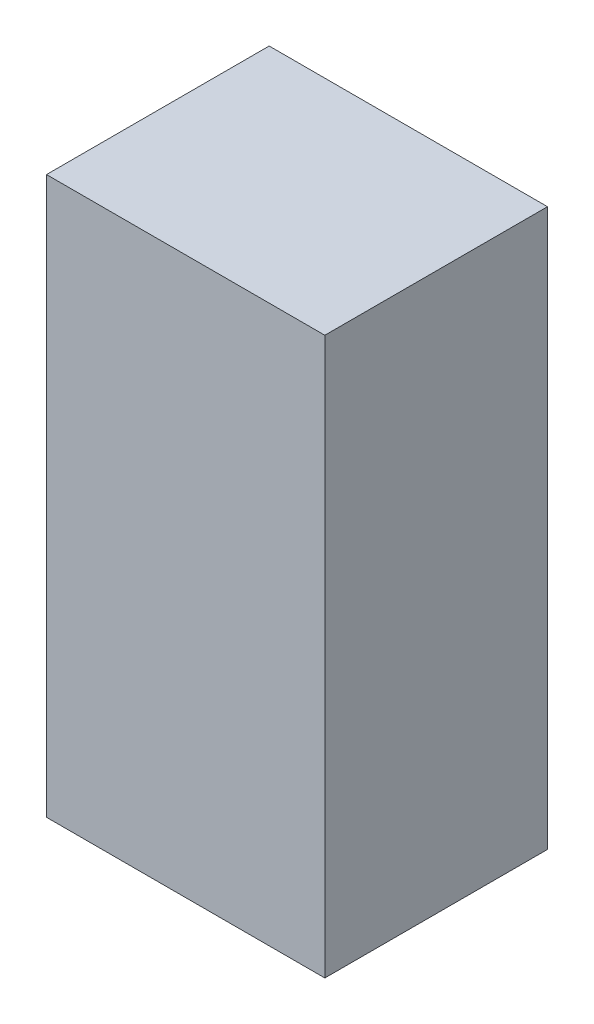
ISO-10303-21;
HEADER;
FILE_DESCRIPTION(('STEP AP214'),'2;1');
FILE_NAME('part.step','',(''),(''),'','','');
FILE_SCHEMA(('AUTOMOTIVE_DESIGN { 1 0 10303 214 1 1 1 1 }'));
ENDSEC;
DATA;
#1=APPLICATION_CONTEXT('core data for automotive mechanical design processes');
#2=APPLICATION_PROTOCOL_DEFINITION('international standard','automotive_design',2000,#1);
#3=PRODUCT_CONTEXT('',#1,'mechanical');
#4=PRODUCT('Part','Part','',(#3));
#5=PRODUCT_RELATED_PRODUCT_CATEGORY('part','',(#4));
#6=PRODUCT_DEFINITION_FORMATION('','',#4);
#7=PRODUCT_DEFINITION_CONTEXT('part definition',#1,'design');
#8=PRODUCT_DEFINITION('design','',#6,#7);
#9=PRODUCT_DEFINITION_SHAPE('','',#8);
#10=(LENGTH_UNIT() NAMED_UNIT(*) SI_UNIT(.MILLI.,.METRE.));
#11=(NAMED_UNIT(*) PLANE_ANGLE_UNIT() SI_UNIT($,.RADIAN.));
#12=(NAMED_UNIT(*) SI_UNIT($,.STERADIAN.) SOLID_ANGLE_UNIT());
#13=UNCERTAINTY_MEASURE_WITH_UNIT(LENGTH_MEASURE(1.E-05),#10,'distance_accuracy_value','');
#14=(GEOMETRIC_REPRESENTATION_CONTEXT(3) GLOBAL_UNCERTAINTY_ASSIGNED_CONTEXT((#13)) GLOBAL_UNIT_ASSIGNED_CONTEXT((#10,
#11,#12)) REPRESENTATION_CONTEXT('',''));
#15=CARTESIAN_POINT('',(0.,0.,0.));
#16=DIRECTION('',(0.,0.,1.));
#17=DIRECTION('',(1.,0.,0.));
#18=AXIS2_PLACEMENT_3D('',#15,#16,#17);
#19=CARTESIAN_POINT('',(25.,100.,-20.));
#20=DIRECTION('',(-1.,0.,0.));
#21=DIRECTION('',(0.,0.,1.));
#22=AXIS2_PLACEMENT_3D('',#19,#20,#21);
#23=PLANE('',#22);
#24=DIRECTION('',(0.,0.,-1.));
#25=VECTOR('',#24,1.);
#26=CARTESIAN_POINT('',(25.,0.,-20.));
#27=LINE('',#26,#25);
#28=CARTESIAN_POINT('',(25.,0.,20.));
#29=VERTEX_POINT('',#28);
#30=CARTESIAN_POINT('',(25.,0.,-20.));
#31=VERTEX_POINT('',#30);
#32=EDGE_CURVE('E99',#29,#31,#27,.T.);
#33=ORIENTED_EDGE('',*,*,#32,.T.);
#34=DIRECTION('',(0.,-1.,0.));
#35=VECTOR('',#34,1.);
#36=CARTESIAN_POINT('',(25.,100.,-20.));
#37=LINE('',#36,#35);
#38=CARTESIAN_POINT('',(25.,100.,-20.));
#39=VERTEX_POINT('',#38);
#40=EDGE_CURVE('E11',#39,#31,#37,.T.);
#41=ORIENTED_EDGE('',*,*,#40,.F.);
#42=DIRECTION('',(0.,0.,-1.));
#43=VECTOR('',#42,1.);
#44=CARTESIAN_POINT('',(25.,100.,-20.));
#45=LINE('',#44,#43);
#46=CARTESIAN_POINT('',(25.,100.,20.));
#47=VERTEX_POINT('',#46);
#48=EDGE_CURVE('E87',#47,#39,#45,.T.);
#49=ORIENTED_EDGE('',*,*,#48,.F.);
#50=DIRECTION('',(0.,-1.,0.));
#51=VECTOR('',#50,1.);
#52=CARTESIAN_POINT('',(25.,100.,20.));
#53=LINE('',#52,#51);
#54=EDGE_CURVE('E95',#47,#29,#53,.T.);
#55=ORIENTED_EDGE('',*,*,#54,.T.);
#56=EDGE_LOOP('',(#33,#41,#49,#55));
#57=FACE_BOUND('',#56,.T.);
#58=ADVANCED_FACE('F36',(#57),#23,.F.);
#59=CARTESIAN_POINT('',(-25.,100.,-20.));
#60=DIRECTION('',(0.,0.,1.));
#61=DIRECTION('',(1.,0.,0.));
#62=AXIS2_PLACEMENT_3D('',#59,#60,#61);
#63=PLANE('',#62);
#64=DIRECTION('',(-1.,0.,0.));
#65=VECTOR('',#64,1.);
#66=CARTESIAN_POINT('',(-25.,0.,-20.));
#67=LINE('',#66,#65);
#68=CARTESIAN_POINT('',(-25.,0.,-20.));
#69=VERTEX_POINT('',#68);
#70=EDGE_CURVE('E91',#31,#69,#67,.T.);
#71=ORIENTED_EDGE('',*,*,#70,.T.);
#72=DIRECTION('',(0.,-1.,0.));
#73=VECTOR('',#72,1.);
#74=CARTESIAN_POINT('',(-25.,100.,-20.));
#75=LINE('',#74,#73);
#76=CARTESIAN_POINT('',(-25.,100.,-20.));
#77=VERTEX_POINT('',#76);
#78=EDGE_CURVE('E44',#77,#69,#75,.T.);
#79=ORIENTED_EDGE('',*,*,#78,.F.);
#80=DIRECTION('',(-1.,0.,0.));
#81=VECTOR('',#80,1.);
#82=CARTESIAN_POINT('',(-25.,100.,-20.));
#83=LINE('',#82,#81);
#84=EDGE_CURVE('E82',#39,#77,#83,.T.);
#85=ORIENTED_EDGE('',*,*,#84,.F.);
#86=ORIENTED_EDGE('',*,*,#40,.T.);
#87=EDGE_LOOP('',(#71,#79,#85,#86));
#88=FACE_BOUND('',#87,.T.);
#89=ADVANCED_FACE('F90',(#88),#63,.F.);
#90=CARTESIAN_POINT('',(-25.,100.,-20.));
#91=DIRECTION('',(1.,0.,0.));
#92=DIRECTION('',(0.,0.,-1.));
#93=AXIS2_PLACEMENT_3D('',#90,#91,#92);
#94=PLANE('',#93);
#95=DIRECTION('',(0.,0.,1.));
#96=VECTOR('',#95,1.);
#97=CARTESIAN_POINT('',(-25.,0.,-20.));
#98=LINE('',#97,#96);
#99=CARTESIAN_POINT('',(-25.,0.,20.));
#100=VERTEX_POINT('',#99);
#101=EDGE_CURVE('E69',#69,#100,#98,.T.);
#102=ORIENTED_EDGE('',*,*,#101,.T.);
#103=DIRECTION('',(0.,-1.,0.));
#104=VECTOR('',#103,1.);
#105=CARTESIAN_POINT('',(-25.,100.,20.));
#106=LINE('',#105,#104);
#107=CARTESIAN_POINT('',(-25.,100.,20.));
#108=VERTEX_POINT('',#107);
#109=EDGE_CURVE('E92',#108,#100,#106,.T.);
#110=ORIENTED_EDGE('',*,*,#109,.F.);
#111=DIRECTION('',(0.,0.,1.));
#112=VECTOR('',#111,1.);
#113=CARTESIAN_POINT('',(-25.,100.,-20.));
#114=LINE('',#113,#112);
#115=EDGE_CURVE('E85',#77,#108,#114,.T.);
#116=ORIENTED_EDGE('',*,*,#115,.F.);
#117=ORIENTED_EDGE('',*,*,#78,.T.);
#118=EDGE_LOOP('',(#102,#110,#116,#117));
#119=FACE_BOUND('',#118,.T.);
#120=ADVANCED_FACE('F93',(#119),#94,.F.);
#121=CARTESIAN_POINT('',(-25.,100.,20.));
#122=DIRECTION('',(0.,0.,-1.));
#123=DIRECTION('',(-1.,0.,0.));
#124=AXIS2_PLACEMENT_3D('',#121,#122,#123);
#125=PLANE('',#124);
#126=DIRECTION('',(1.,0.,0.));
#127=VECTOR('',#126,1.);
#128=CARTESIAN_POINT('',(-25.,0.,20.));
#129=LINE('',#128,#127);
#130=EDGE_CURVE('E75',#100,#29,#129,.T.);
#131=ORIENTED_EDGE('',*,*,#130,.T.);
#132=ORIENTED_EDGE('',*,*,#54,.F.);
#133=DIRECTION('',(1.,0.,0.));
#134=VECTOR('',#133,1.);
#135=CARTESIAN_POINT('',(-25.,100.,20.));
#136=LINE('',#135,#134);
#137=EDGE_CURVE('E52',#108,#47,#136,.T.);
#138=ORIENTED_EDGE('',*,*,#137,.F.);
#139=ORIENTED_EDGE('',*,*,#109,.T.);
#140=EDGE_LOOP('',(#131,#132,#138,#139));
#141=FACE_BOUND('',#140,.T.);
#142=ADVANCED_FACE('F106',(#141),#125,.F.);
#143=CARTESIAN_POINT('',(0.,100.,0.));
#144=DIRECTION('',(0.,1.,0.));
#145=DIRECTION('',(0.,0.,1.));
#146=AXIS2_PLACEMENT_3D('',#143,#144,#145);
#147=PLANE('',#146);
#148=ORIENTED_EDGE('',*,*,#48,.T.);
#149=ORIENTED_EDGE('',*,*,#84,.T.);
#150=ORIENTED_EDGE('',*,*,#115,.T.);
#151=ORIENTED_EDGE('',*,*,#137,.T.);
#152=EDGE_LOOP('',(#148,#149,#150,#151));
#153=FACE_BOUND('',#152,.T.);
#154=ADVANCED_FACE('F83',(#153),#147,.T.);
#155=CARTESIAN_POINT('',(0.,0.,0.));
#156=DIRECTION('',(0.,1.,0.));
#157=DIRECTION('',(0.,0.,1.));
#158=AXIS2_PLACEMENT_3D('',#155,#156,#157);
#159=PLANE('',#158);
#160=ORIENTED_EDGE('',*,*,#32,.F.);
#161=ORIENTED_EDGE('',*,*,#130,.F.);
#162=ORIENTED_EDGE('',*,*,#101,.F.);
#163=ORIENTED_EDGE('',*,*,#70,.F.);
#164=EDGE_LOOP('',(#160,#161,#162,#163));
#165=FACE_BOUND('',#164,.T.);
#166=ADVANCED_FACE('F109',(#165),#159,.F.);
#167=CLOSED_SHELL('',(#58,#89,#120,#142,#154,#166));
#168=MANIFOLD_SOLID_BREP('B2',#167);
#169=ADVANCED_BREP_SHAPE_REPRESENTATION('',(#18,#168),#14);
#170=SHAPE_DEFINITION_REPRESENTATION(#9,#169);
ENDSEC;
END-ISO-10303-21;
